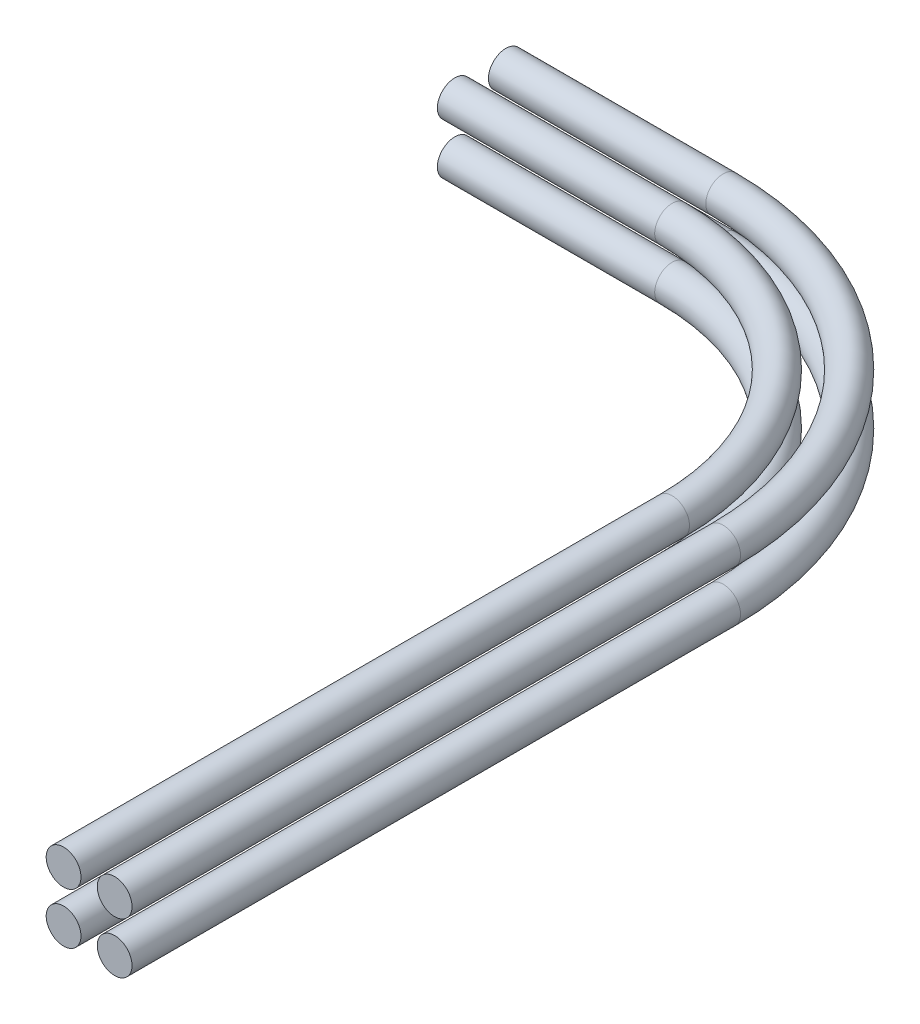
ISO-10303-21;
HEADER;
FILE_DESCRIPTION(('STEP AP214'),'2;1');
FILE_NAME('part.step','',(''),(''),'','','');
FILE_SCHEMA(('AUTOMOTIVE_DESIGN { 1 0 10303 214 1 1 1 1 }'));
ENDSEC;
DATA;
#1=APPLICATION_CONTEXT('core data for automotive mechanical design processes');
#2=APPLICATION_PROTOCOL_DEFINITION('international standard','automotive_design',2000,#1);
#3=PRODUCT_CONTEXT('',#1,'mechanical');
#4=PRODUCT('Part','Part','',(#3));
#5=PRODUCT_RELATED_PRODUCT_CATEGORY('part','',(#4));
#6=PRODUCT_DEFINITION_FORMATION('','',#4);
#7=PRODUCT_DEFINITION_CONTEXT('part definition',#1,'design');
#8=PRODUCT_DEFINITION('design','',#6,#7);
#9=PRODUCT_DEFINITION_SHAPE('','',#8);
#10=(LENGTH_UNIT() NAMED_UNIT(*) SI_UNIT(.MILLI.,.METRE.));
#11=(NAMED_UNIT(*) PLANE_ANGLE_UNIT() SI_UNIT($,.RADIAN.));
#12=(NAMED_UNIT(*) SI_UNIT($,.STERADIAN.) SOLID_ANGLE_UNIT());
#13=UNCERTAINTY_MEASURE_WITH_UNIT(LENGTH_MEASURE(1.E-05),#10,'distance_accuracy_value','');
#14=(GEOMETRIC_REPRESENTATION_CONTEXT(3) GLOBAL_UNCERTAINTY_ASSIGNED_CONTEXT((#13)) GLOBAL_UNIT_ASSIGNED_CONTEXT((#10,
#11,#12)) REPRESENTATION_CONTEXT('',''));
#15=CARTESIAN_POINT('',(0.,0.,0.));
#16=DIRECTION('',(0.,0.,1.));
#17=DIRECTION('',(1.,0.,0.));
#18=AXIS2_PLACEMENT_3D('',#15,#16,#17);
#19=CARTESIAN_POINT('',(43.3,4.7,28.));
#20=DIRECTION('',(0.,0.,1.));
#21=DIRECTION('',(1.,0.,0.));
#22=AXIS2_PLACEMENT_3D('',#19,#20,#21);
#23=CYLINDRICAL_SURFACE('',#22,1.6);
#24=CARTESIAN_POINT('',(43.3,4.7,28.));
#25=DIRECTION('',(0.,0.,1.));
#26=DIRECTION('',(1.,0.,0.));
#27=AXIS2_PLACEMENT_3D('',#24,#25,#26);
#28=CIRCLE('',#27,1.6);
#29=CARTESIAN_POINT('',(44.9,4.7,28.));
#30=VERTEX_POINT('',#29);
#31=EDGE_CURVE('E53',#30,#30,#28,.T.);
#32=ORIENTED_EDGE('',*,*,#31,.T.);
#33=EDGE_LOOP('',(#32));
#34=FACE_BOUND('',#33,.T.);
#35=CARTESIAN_POINT('',(43.3,4.7,84.));
#36=DIRECTION('',(0.,0.,1.));
#37=DIRECTION('',(1.,0.,0.));
#38=AXIS2_PLACEMENT_3D('',#35,#36,#37);
#39=CIRCLE('',#38,1.6);
#40=CARTESIAN_POINT('',(44.9,4.7,84.));
#41=VERTEX_POINT('',#40);
#42=EDGE_CURVE('E11',#41,#41,#39,.T.);
#43=ORIENTED_EDGE('',*,*,#42,.F.);
#44=EDGE_LOOP('',(#43));
#45=FACE_BOUND('',#44,.T.);
#46=ADVANCED_FACE('F46',(#34,#45),#23,.T.);
#47=CARTESIAN_POINT('',(20.,4.7,28.));
#48=DIRECTION('',(0.,-1.,0.));
#49=DIRECTION('',(0.,0.,-1.));
#50=AXIS2_PLACEMENT_3D('',#47,#48,#49);
#51=TOROIDAL_SURFACE('',#50,23.3,1.6);
#52=CARTESIAN_POINT('',(20.,4.7,4.7));
#53=DIRECTION('',(1.,0.,0.));
#54=DIRECTION('',(0.,0.,-1.));
#55=AXIS2_PLACEMENT_3D('',#52,#53,#54);
#56=CIRCLE('',#55,1.6);
#57=CARTESIAN_POINT('',(20.,4.7,3.1));
#58=VERTEX_POINT('',#57);
#59=EDGE_CURVE('E59',#58,#58,#56,.T.);
#60=CARTESIAN_POINT('',(20.,4.7,28.));
#61=DIRECTION('',(0.,-1.,0.));
#62=DIRECTION('',(0.,0.,-1.));
#63=AXIS2_PLACEMENT_3D('',#60,#61,#62);
#64=CIRCLE('',#63,24.9);
#65=EDGE_CURVE('',#58,#30,#64,.T.);
#66=ORIENTED_EDGE('',*,*,#59,.T.);
#67=ORIENTED_EDGE('',*,*,#31,.F.);
#68=ORIENTED_EDGE('',*,*,#65,.T.);
#69=ORIENTED_EDGE('',*,*,#65,.F.);
#70=EDGE_LOOP('',(#66,#68,#67,#69));
#71=FACE_BOUND('',#70,.T.);
#72=ADVANCED_FACE('F81',(#71),#51,.T.);
#73=CARTESIAN_POINT('',(20.,4.7,4.7));
#74=DIRECTION('',(-1.,0.,0.));
#75=DIRECTION('',(0.,0.,1.));
#76=AXIS2_PLACEMENT_3D('',#73,#74,#75);
#77=CYLINDRICAL_SURFACE('',#76,1.6);
#78=ORIENTED_EDGE('',*,*,#59,.F.);
#79=EDGE_LOOP('',(#78));
#80=FACE_BOUND('',#79,.T.);
#81=CARTESIAN_POINT('',(0.,4.7,4.7));
#82=DIRECTION('',(1.,0.,0.));
#83=DIRECTION('',(0.,0.,-1.));
#84=AXIS2_PLACEMENT_3D('',#81,#82,#83);
#85=CIRCLE('',#84,1.6);
#86=CARTESIAN_POINT('',(0.,4.7,3.1));
#87=VERTEX_POINT('',#86);
#88=EDGE_CURVE('E63',#87,#87,#85,.T.);
#89=ORIENTED_EDGE('',*,*,#88,.T.);
#90=EDGE_LOOP('',(#89));
#91=FACE_BOUND('',#90,.T.);
#92=ADVANCED_FACE('F69',(#80,#91),#77,.T.);
#93=CARTESIAN_POINT('',(43.3,4.7,84.));
#94=DIRECTION('',(0.,0.,1.));
#95=DIRECTION('',(1.,0.,0.));
#96=AXIS2_PLACEMENT_3D('',#93,#94,#95);
#97=PLANE('',#96);
#98=ORIENTED_EDGE('',*,*,#42,.T.);
#99=EDGE_LOOP('',(#98));
#100=FACE_BOUND('',#99,.T.);
#101=ADVANCED_FACE('F73',(#100),#97,.T.);
#102=CARTESIAN_POINT('',(0.,4.7,4.7));
#103=DIRECTION('',(1.,0.,0.));
#104=DIRECTION('',(0.,0.,-1.));
#105=AXIS2_PLACEMENT_3D('',#102,#103,#104);
#106=PLANE('',#105);
#107=ORIENTED_EDGE('',*,*,#88,.F.);
#108=EDGE_LOOP('',(#107));
#109=FACE_BOUND('',#108,.T.);
#110=ADVANCED_FACE('F71',(#109),#106,.F.);
#111=CLOSED_SHELL('',(#46,#72,#92,#101,#110));
#112=MANIFOLD_SOLID_BREP('B2',#111);
#113=CARTESIAN_POINT('',(48.,4.7,28.));
#114=DIRECTION('',(0.,0.,1.));
#115=DIRECTION('',(1.,0.,0.));
#116=AXIS2_PLACEMENT_3D('',#113,#114,#115);
#117=CYLINDRICAL_SURFACE('',#116,1.6);
#118=CARTESIAN_POINT('',(48.,4.7,28.));
#119=DIRECTION('',(0.,0.,1.));
#120=DIRECTION('',(1.,0.,0.));
#121=AXIS2_PLACEMENT_3D('',#118,#119,#120);
#122=CIRCLE('',#121,1.6);
#123=CARTESIAN_POINT('',(49.6,4.7,28.));
#124=VERTEX_POINT('',#123);
#125=EDGE_CURVE('E136',#124,#124,#122,.T.);
#126=ORIENTED_EDGE('',*,*,#125,.T.);
#127=EDGE_LOOP('',(#126));
#128=FACE_BOUND('',#127,.T.);
#129=CARTESIAN_POINT('',(48.,4.7,84.));
#130=DIRECTION('',(0.,0.,1.));
#131=DIRECTION('',(1.,0.,0.));
#132=AXIS2_PLACEMENT_3D('',#129,#130,#131);
#133=CIRCLE('',#132,1.6);
#134=CARTESIAN_POINT('',(49.6,4.7,84.));
#135=VERTEX_POINT('',#134);
#136=EDGE_CURVE('E45',#135,#135,#133,.T.);
#137=ORIENTED_EDGE('',*,*,#136,.F.);
#138=EDGE_LOOP('',(#137));
#139=FACE_BOUND('',#138,.T.);
#140=ADVANCED_FACE('F130',(#128,#139),#117,.T.);
#141=CARTESIAN_POINT('',(20.,4.7,28.));
#142=DIRECTION('',(0.,-1.,0.));
#143=DIRECTION('',(0.,0.,-1.));
#144=AXIS2_PLACEMENT_3D('',#141,#142,#143);
#145=TOROIDAL_SURFACE('',#144,28.,1.6);
#146=CARTESIAN_POINT('',(20.,4.7,0.));
#147=DIRECTION('',(1.,0.,0.));
#148=DIRECTION('',(0.,0.,-1.));
#149=AXIS2_PLACEMENT_3D('',#146,#147,#148);
#150=CIRCLE('',#149,1.6);
#151=CARTESIAN_POINT('',(20.,4.7,-1.6));
#152=VERTEX_POINT('',#151);
#153=EDGE_CURVE('E141',#152,#152,#150,.T.);
#154=CARTESIAN_POINT('',(20.,4.7,28.));
#155=DIRECTION('',(0.,-1.,0.));
#156=DIRECTION('',(0.,0.,-1.));
#157=AXIS2_PLACEMENT_3D('',#154,#155,#156);
#158=CIRCLE('',#157,29.6);
#159=EDGE_CURVE('',#152,#124,#158,.T.);
#160=ORIENTED_EDGE('',*,*,#153,.T.);
#161=ORIENTED_EDGE('',*,*,#125,.F.);
#162=ORIENTED_EDGE('',*,*,#159,.T.);
#163=ORIENTED_EDGE('',*,*,#159,.F.);
#164=EDGE_LOOP('',(#160,#162,#161,#163));
#165=FACE_BOUND('',#164,.T.);
#166=ADVANCED_FACE('F164',(#165),#145,.T.);
#167=CARTESIAN_POINT('',(20.,4.7,0.));
#168=DIRECTION('',(-1.,0.,0.));
#169=DIRECTION('',(0.,0.,1.));
#170=AXIS2_PLACEMENT_3D('',#167,#168,#169);
#171=CYLINDRICAL_SURFACE('',#170,1.6);
#172=ORIENTED_EDGE('',*,*,#153,.F.);
#173=EDGE_LOOP('',(#172));
#174=FACE_BOUND('',#173,.T.);
#175=CARTESIAN_POINT('',(0.,4.7,0.));
#176=DIRECTION('',(1.,0.,0.));
#177=DIRECTION('',(0.,0.,-1.));
#178=AXIS2_PLACEMENT_3D('',#175,#176,#177);
#179=CIRCLE('',#178,1.6);
#180=CARTESIAN_POINT('',(0.,4.7,-1.6));
#181=VERTEX_POINT('',#180);
#182=EDGE_CURVE('E146',#181,#181,#179,.T.);
#183=ORIENTED_EDGE('',*,*,#182,.T.);
#184=EDGE_LOOP('',(#183));
#185=FACE_BOUND('',#184,.T.);
#186=ADVANCED_FACE('F152',(#174,#185),#171,.T.);
#187=CARTESIAN_POINT('',(48.,4.7,84.));
#188=DIRECTION('',(0.,0.,1.));
#189=DIRECTION('',(1.,0.,0.));
#190=AXIS2_PLACEMENT_3D('',#187,#188,#189);
#191=PLANE('',#190);
#192=ORIENTED_EDGE('',*,*,#136,.T.);
#193=EDGE_LOOP('',(#192));
#194=FACE_BOUND('',#193,.T.);
#195=ADVANCED_FACE('F156',(#194),#191,.T.);
#196=CARTESIAN_POINT('',(0.,4.7,0.));
#197=DIRECTION('',(1.,0.,0.));
#198=DIRECTION('',(0.,0.,-1.));
#199=AXIS2_PLACEMENT_3D('',#196,#197,#198);
#200=PLANE('',#199);
#201=ORIENTED_EDGE('',*,*,#182,.F.);
#202=EDGE_LOOP('',(#201));
#203=FACE_BOUND('',#202,.T.);
#204=ADVANCED_FACE('F154',(#203),#200,.F.);
#205=CLOSED_SHELL('',(#140,#166,#186,#195,#204));
#206=MANIFOLD_SOLID_BREP('B6',#205);
#207=CARTESIAN_POINT('',(43.3,0.,28.));
#208=DIRECTION('',(0.,0.,1.));
#209=DIRECTION('',(1.,0.,0.));
#210=AXIS2_PLACEMENT_3D('',#207,#208,#209);
#211=CYLINDRICAL_SURFACE('',#210,1.6);
#212=CARTESIAN_POINT('',(43.3,0.,28.));
#213=DIRECTION('',(0.,0.,1.));
#214=DIRECTION('',(1.,0.,0.));
#215=AXIS2_PLACEMENT_3D('',#212,#213,#214);
#216=CIRCLE('',#215,1.6);
#217=CARTESIAN_POINT('',(44.9,0.,28.));
#218=VERTEX_POINT('',#217);
#219=EDGE_CURVE('E216',#218,#218,#216,.T.);
#220=ORIENTED_EDGE('',*,*,#219,.T.);
#221=EDGE_LOOP('',(#220));
#222=FACE_BOUND('',#221,.T.);
#223=CARTESIAN_POINT('',(43.3,0.,84.));
#224=DIRECTION('',(0.,0.,1.));
#225=DIRECTION('',(1.,0.,0.));
#226=AXIS2_PLACEMENT_3D('',#223,#224,#225);
#227=CIRCLE('',#226,1.6);
#228=CARTESIAN_POINT('',(44.9,0.,84.));
#229=VERTEX_POINT('',#228);
#230=EDGE_CURVE('E129',#229,#229,#227,.T.);
#231=ORIENTED_EDGE('',*,*,#230,.F.);
#232=EDGE_LOOP('',(#231));
#233=FACE_BOUND('',#232,.T.);
#234=ADVANCED_FACE('F210',(#222,#233),#211,.T.);
#235=CARTESIAN_POINT('',(20.,0.,28.));
#236=DIRECTION('',(0.,-1.,0.));
#237=DIRECTION('',(0.,0.,-1.));
#238=AXIS2_PLACEMENT_3D('',#235,#236,#237);
#239=TOROIDAL_SURFACE('',#238,23.3,1.6);
#240=CARTESIAN_POINT('',(20.,0.,4.7));
#241=DIRECTION('',(1.,0.,0.));
#242=DIRECTION('',(0.,0.,-1.));
#243=AXIS2_PLACEMENT_3D('',#240,#241,#242);
#244=CIRCLE('',#243,1.6);
#245=CARTESIAN_POINT('',(20.,0.,3.1));
#246=VERTEX_POINT('',#245);
#247=EDGE_CURVE('E221',#246,#246,#244,.T.);
#248=CARTESIAN_POINT('',(20.,0.,28.));
#249=DIRECTION('',(0.,-1.,0.));
#250=DIRECTION('',(0.,0.,-1.));
#251=AXIS2_PLACEMENT_3D('',#248,#249,#250);
#252=CIRCLE('',#251,24.9);
#253=EDGE_CURVE('',#246,#218,#252,.T.);
#254=ORIENTED_EDGE('',*,*,#247,.T.);
#255=ORIENTED_EDGE('',*,*,#219,.F.);
#256=ORIENTED_EDGE('',*,*,#253,.T.);
#257=ORIENTED_EDGE('',*,*,#253,.F.);
#258=EDGE_LOOP('',(#254,#256,#255,#257));
#259=FACE_BOUND('',#258,.T.);
#260=ADVANCED_FACE('F243',(#259),#239,.T.);
#261=CARTESIAN_POINT('',(20.,0.,4.7));
#262=DIRECTION('',(-1.,0.,0.));
#263=DIRECTION('',(0.,0.,1.));
#264=AXIS2_PLACEMENT_3D('',#261,#262,#263);
#265=CYLINDRICAL_SURFACE('',#264,1.6);
#266=ORIENTED_EDGE('',*,*,#247,.F.);
#267=EDGE_LOOP('',(#266));
#268=FACE_BOUND('',#267,.T.);
#269=CARTESIAN_POINT('',(0.,0.,4.7));
#270=DIRECTION('',(1.,0.,0.));
#271=DIRECTION('',(0.,0.,-1.));
#272=AXIS2_PLACEMENT_3D('',#269,#270,#271);
#273=CIRCLE('',#272,1.6);
#274=CARTESIAN_POINT('',(0.,0.,3.1));
#275=VERTEX_POINT('',#274);
#276=EDGE_CURVE('E225',#275,#275,#273,.T.);
#277=ORIENTED_EDGE('',*,*,#276,.T.);
#278=EDGE_LOOP('',(#277));
#279=FACE_BOUND('',#278,.T.);
#280=ADVANCED_FACE('F231',(#268,#279),#265,.T.);
#281=CARTESIAN_POINT('',(43.3,0.,84.));
#282=DIRECTION('',(0.,0.,1.));
#283=DIRECTION('',(1.,0.,0.));
#284=AXIS2_PLACEMENT_3D('',#281,#282,#283);
#285=PLANE('',#284);
#286=ORIENTED_EDGE('',*,*,#230,.T.);
#287=EDGE_LOOP('',(#286));
#288=FACE_BOUND('',#287,.T.);
#289=ADVANCED_FACE('F235',(#288),#285,.T.);
#290=CARTESIAN_POINT('',(0.,0.,4.7));
#291=DIRECTION('',(1.,0.,0.));
#292=DIRECTION('',(0.,0.,-1.));
#293=AXIS2_PLACEMENT_3D('',#290,#291,#292);
#294=PLANE('',#293);
#295=ORIENTED_EDGE('',*,*,#276,.F.);
#296=EDGE_LOOP('',(#295));
#297=FACE_BOUND('',#296,.T.);
#298=ADVANCED_FACE('F233',(#297),#294,.F.);
#299=CLOSED_SHELL('',(#234,#260,#280,#289,#298));
#300=MANIFOLD_SOLID_BREP('B40',#299);
#301=CARTESIAN_POINT('',(48.,0.,28.));
#302=DIRECTION('',(0.,0.,1.));
#303=DIRECTION('',(1.,0.,0.));
#304=AXIS2_PLACEMENT_3D('',#301,#302,#303);
#305=CYLINDRICAL_SURFACE('',#304,1.6);
#306=CARTESIAN_POINT('',(48.,0.,28.));
#307=DIRECTION('',(0.,0.,1.));
#308=DIRECTION('',(1.,0.,0.));
#309=AXIS2_PLACEMENT_3D('',#306,#307,#308);
#310=CIRCLE('',#309,1.6);
#311=CARTESIAN_POINT('',(49.6,0.,28.));
#312=VERTEX_POINT('',#311);
#313=EDGE_CURVE('E288',#312,#312,#310,.T.);
#314=ORIENTED_EDGE('',*,*,#313,.T.);
#315=EDGE_LOOP('',(#314));
#316=FACE_BOUND('',#315,.T.);
#317=CARTESIAN_POINT('',(48.,0.,84.));
#318=DIRECTION('',(0.,0.,1.));
#319=DIRECTION('',(1.,0.,0.));
#320=AXIS2_PLACEMENT_3D('',#317,#318,#319);
#321=CIRCLE('',#320,1.6);
#322=CARTESIAN_POINT('',(49.6,0.,84.));
#323=VERTEX_POINT('',#322);
#324=EDGE_CURVE('E209',#323,#323,#321,.T.);
#325=ORIENTED_EDGE('',*,*,#324,.F.);
#326=EDGE_LOOP('',(#325));
#327=FACE_BOUND('',#326,.T.);
#328=ADVANCED_FACE('F282',(#316,#327),#305,.T.);
#329=CARTESIAN_POINT('',(20.,0.,28.));
#330=DIRECTION('',(0.,-1.,0.));
#331=DIRECTION('',(0.,0.,-1.));
#332=AXIS2_PLACEMENT_3D('',#329,#330,#331);
#333=TOROIDAL_SURFACE('',#332,28.,1.6);
#334=CARTESIAN_POINT('',(20.,0.,0.));
#335=DIRECTION('',(1.,0.,0.));
#336=DIRECTION('',(0.,0.,-1.));
#337=AXIS2_PLACEMENT_3D('',#334,#335,#336);
#338=CIRCLE('',#337,1.6);
#339=CARTESIAN_POINT('',(20.,0.,-1.6));
#340=VERTEX_POINT('',#339);
#341=EDGE_CURVE('E293',#340,#340,#338,.T.);
#342=CARTESIAN_POINT('',(20.,0.,28.));
#343=DIRECTION('',(0.,-1.,0.));
#344=DIRECTION('',(0.,0.,-1.));
#345=AXIS2_PLACEMENT_3D('',#342,#343,#344);
#346=CIRCLE('',#345,29.6);
#347=EDGE_CURVE('',#340,#312,#346,.T.);
#348=ORIENTED_EDGE('',*,*,#341,.T.);
#349=ORIENTED_EDGE('',*,*,#313,.F.);
#350=ORIENTED_EDGE('',*,*,#347,.T.);
#351=ORIENTED_EDGE('',*,*,#347,.F.);
#352=EDGE_LOOP('',(#348,#350,#349,#351));
#353=FACE_BOUND('',#352,.T.);
#354=ADVANCED_FACE('F315',(#353),#333,.T.);
#355=CARTESIAN_POINT('',(20.,0.,0.));
#356=DIRECTION('',(-1.,0.,0.));
#357=DIRECTION('',(0.,0.,1.));
#358=AXIS2_PLACEMENT_3D('',#355,#356,#357);
#359=CYLINDRICAL_SURFACE('',#358,1.6);
#360=ORIENTED_EDGE('',*,*,#341,.F.);
#361=EDGE_LOOP('',(#360));
#362=FACE_BOUND('',#361,.T.);
#363=CARTESIAN_POINT('',(0.,0.,0.));
#364=DIRECTION('',(1.,0.,0.));
#365=DIRECTION('',(0.,0.,-1.));
#366=AXIS2_PLACEMENT_3D('',#363,#364,#365);
#367=CIRCLE('',#366,1.6);
#368=CARTESIAN_POINT('',(0.,0.,-1.6));
#369=VERTEX_POINT('',#368);
#370=EDGE_CURVE('E297',#369,#369,#367,.T.);
#371=ORIENTED_EDGE('',*,*,#370,.T.);
#372=EDGE_LOOP('',(#371));
#373=FACE_BOUND('',#372,.T.);
#374=ADVANCED_FACE('F303',(#362,#373),#359,.T.);
#375=CARTESIAN_POINT('',(48.,0.,84.));
#376=DIRECTION('',(0.,0.,1.));
#377=DIRECTION('',(1.,0.,0.));
#378=AXIS2_PLACEMENT_3D('',#375,#376,#377);
#379=PLANE('',#378);
#380=ORIENTED_EDGE('',*,*,#324,.T.);
#381=EDGE_LOOP('',(#380));
#382=FACE_BOUND('',#381,.T.);
#383=ADVANCED_FACE('F307',(#382),#379,.T.);
#384=CARTESIAN_POINT('',(0.,0.,0.));
#385=DIRECTION('',(1.,0.,0.));
#386=DIRECTION('',(0.,0.,-1.));
#387=AXIS2_PLACEMENT_3D('',#384,#385,#386);
#388=PLANE('',#387);
#389=ORIENTED_EDGE('',*,*,#370,.F.);
#390=EDGE_LOOP('',(#389));
#391=FACE_BOUND('',#390,.T.);
#392=ADVANCED_FACE('F305',(#391),#388,.F.);
#393=CLOSED_SHELL('',(#328,#354,#374,#383,#392));
#394=MANIFOLD_SOLID_BREP('B124',#393);
#395=ADVANCED_BREP_SHAPE_REPRESENTATION('',(#18,#112,#206,#300,#394),#14);
#396=SHAPE_DEFINITION_REPRESENTATION(#9,#395);
ENDSEC;
END-ISO-10303-21;
